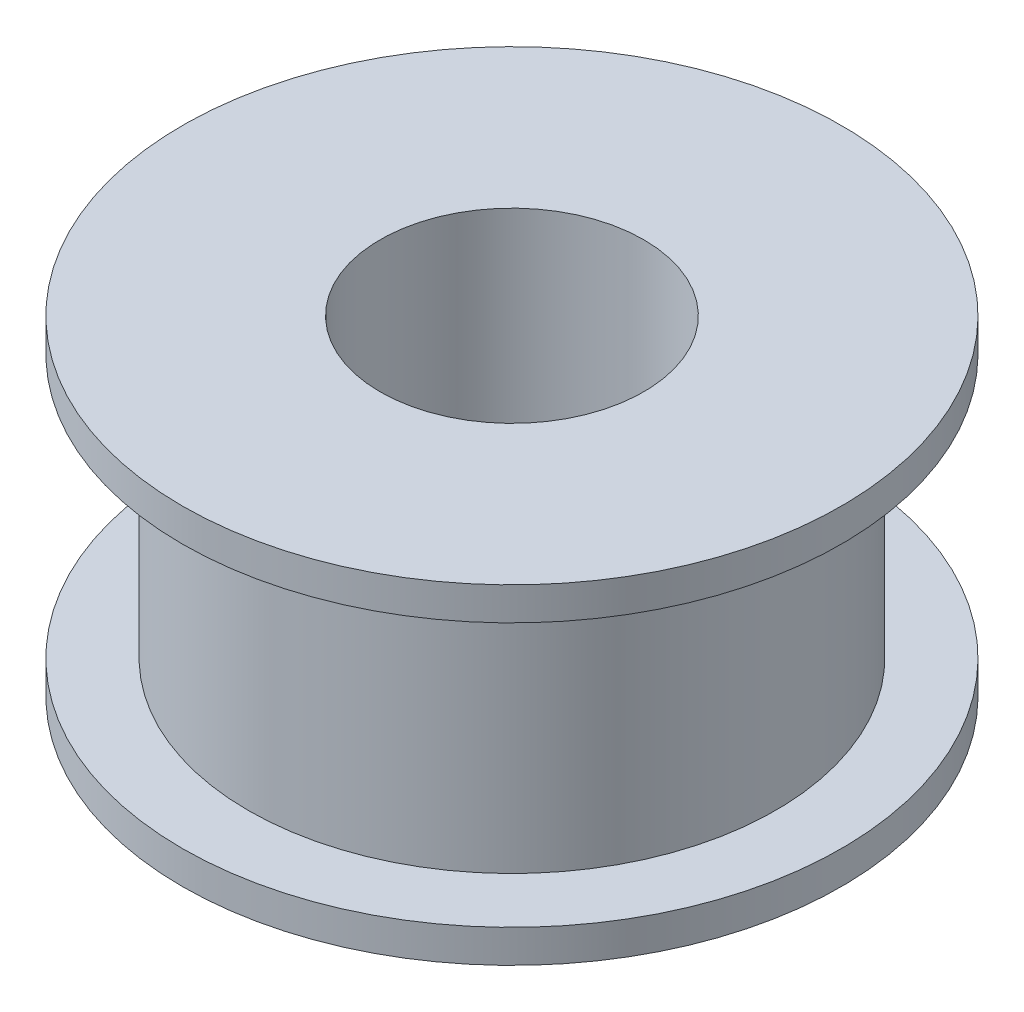
ISO-10303-21;
HEADER;
FILE_DESCRIPTION(('STEP AP214'),'2;1');
FILE_NAME('part.step','',(''),(''),'','','');
FILE_SCHEMA(('AUTOMOTIVE_DESIGN { 1 0 10303 214 1 1 1 1 }'));
ENDSEC;
DATA;
#1=APPLICATION_CONTEXT('core data for automotive mechanical design processes');
#2=APPLICATION_PROTOCOL_DEFINITION('international standard','automotive_design',2000,#1);
#3=PRODUCT_CONTEXT('',#1,'mechanical');
#4=PRODUCT('Part','Part','',(#3));
#5=PRODUCT_RELATED_PRODUCT_CATEGORY('part','',(#4));
#6=PRODUCT_DEFINITION_FORMATION('','',#4);
#7=PRODUCT_DEFINITION_CONTEXT('part definition',#1,'design');
#8=PRODUCT_DEFINITION('design','',#6,#7);
#9=PRODUCT_DEFINITION_SHAPE('','',#8);
#10=(LENGTH_UNIT() NAMED_UNIT(*) SI_UNIT(.MILLI.,.METRE.));
#11=(NAMED_UNIT(*) PLANE_ANGLE_UNIT() SI_UNIT($,.RADIAN.));
#12=(NAMED_UNIT(*) SI_UNIT($,.STERADIAN.) SOLID_ANGLE_UNIT());
#13=UNCERTAINTY_MEASURE_WITH_UNIT(LENGTH_MEASURE(1.E-05),#10,'distance_accuracy_value','');
#14=(GEOMETRIC_REPRESENTATION_CONTEXT(3) GLOBAL_UNCERTAINTY_ASSIGNED_CONTEXT((#13)) GLOBAL_UNIT_ASSIGNED_CONTEXT((#10,
#11,#12)) REPRESENTATION_CONTEXT('',''));
#15=CARTESIAN_POINT('',(0.,0.,0.));
#16=DIRECTION('',(0.,0.,1.));
#17=DIRECTION('',(1.,0.,0.));
#18=AXIS2_PLACEMENT_3D('',#15,#16,#17);
#19=CARTESIAN_POINT('',(0.,25.4,0.));
#20=DIRECTION('',(0.,-1.,0.));
#21=DIRECTION('',(0.,0.,-1.));
#22=AXIS2_PLACEMENT_3D('',#19,#20,#21);
#23=CYLINDRICAL_SURFACE('',#22,25.4);
#24=CARTESIAN_POINT('',(0.,25.4,0.));
#25=DIRECTION('',(0.,1.,0.));
#26=DIRECTION('',(0.,0.,1.));
#27=AXIS2_PLACEMENT_3D('',#24,#25,#26);
#28=CIRCLE('',#27,25.4);
#29=CARTESIAN_POINT('',(0.,25.4,25.4));
#30=VERTEX_POINT('',#29);
#31=EDGE_CURVE('E10',#30,#30,#28,.T.);
#32=ORIENTED_EDGE('',*,*,#31,.F.);
#33=EDGE_LOOP('',(#32));
#34=FACE_BOUND('',#33,.T.);
#35=CARTESIAN_POINT('',(0.,0.,0.));
#36=DIRECTION('',(0.,1.,0.));
#37=DIRECTION('',(0.,0.,1.));
#38=AXIS2_PLACEMENT_3D('',#35,#36,#37);
#39=CIRCLE('',#38,25.4);
#40=CARTESIAN_POINT('',(0.,0.,25.4));
#41=VERTEX_POINT('',#40);
#42=EDGE_CURVE('E42',#41,#41,#39,.T.);
#43=ORIENTED_EDGE('',*,*,#42,.T.);
#44=EDGE_LOOP('',(#43));
#45=FACE_BOUND('',#44,.T.);
#46=ADVANCED_FACE('F39',(#34,#45),#23,.T.);
#47=CARTESIAN_POINT('',(0.,25.4,0.));
#48=DIRECTION('',(0.,-1.,0.));
#49=DIRECTION('',(0.,0.,-1.));
#50=AXIS2_PLACEMENT_3D('',#47,#48,#49);
#51=CYLINDRICAL_SURFACE('',#50,12.7);
#52=CARTESIAN_POINT('',(0.,28.575,0.));
#53=DIRECTION('',(0.,1.,0.));
#54=DIRECTION('',(0.,0.,1.));
#55=AXIS2_PLACEMENT_3D('',#52,#53,#54);
#56=CIRCLE('',#55,12.7);
#57=CARTESIAN_POINT('',(0.,28.575,12.7));
#58=VERTEX_POINT('',#57);
#59=EDGE_CURVE('E57',#58,#58,#56,.T.);
#60=ORIENTED_EDGE('',*,*,#59,.T.);
#61=EDGE_LOOP('',(#60));
#62=FACE_BOUND('',#61,.T.);
#63=CARTESIAN_POINT('',(0.,-3.175,0.));
#64=DIRECTION('',(0.,1.,0.));
#65=DIRECTION('',(0.,0.,1.));
#66=AXIS2_PLACEMENT_3D('',#63,#64,#65);
#67=CIRCLE('',#66,12.7);
#68=CARTESIAN_POINT('',(0.,-3.175,12.7));
#69=VERTEX_POINT('',#68);
#70=EDGE_CURVE('E67',#69,#69,#67,.T.);
#71=ORIENTED_EDGE('',*,*,#70,.F.);
#72=EDGE_LOOP('',(#71));
#73=FACE_BOUND('',#72,.T.);
#74=ADVANCED_FACE('F78',(#62,#73),#51,.F.);
#75=CARTESIAN_POINT('',(0.,28.575,0.));
#76=DIRECTION('',(0.,1.,0.));
#77=DIRECTION('',(0.,0.,1.));
#78=AXIS2_PLACEMENT_3D('',#75,#76,#77);
#79=PLANE('',#78);
#80=CARTESIAN_POINT('',(0.,28.575,0.));
#81=DIRECTION('',(0.,1.,0.));
#82=DIRECTION('',(0.,0.,1.));
#83=AXIS2_PLACEMENT_3D('',#80,#81,#82);
#84=CIRCLE('',#83,31.75);
#85=CARTESIAN_POINT('',(0.,28.575,31.75));
#86=VERTEX_POINT('',#85);
#87=EDGE_CURVE('E47',#86,#86,#84,.T.);
#88=ORIENTED_EDGE('',*,*,#87,.T.);
#89=EDGE_LOOP('',(#88));
#90=FACE_BOUND('',#89,.T.);
#91=ORIENTED_EDGE('',*,*,#59,.F.);
#92=EDGE_LOOP('',(#91));
#93=FACE_BOUND('',#92,.T.);
#94=ADVANCED_FACE('F80',(#90,#93),#79,.T.);
#95=CARTESIAN_POINT('',(0.,25.4,0.));
#96=DIRECTION('',(0.,1.,0.));
#97=DIRECTION('',(0.,0.,1.));
#98=AXIS2_PLACEMENT_3D('',#95,#96,#97);
#99=PLANE('',#98);
#100=ORIENTED_EDGE('',*,*,#31,.T.);
#101=EDGE_LOOP('',(#100));
#102=FACE_BOUND('',#101,.T.);
#103=CARTESIAN_POINT('',(0.,25.4,0.));
#104=DIRECTION('',(0.,1.,0.));
#105=DIRECTION('',(0.,0.,1.));
#106=AXIS2_PLACEMENT_3D('',#103,#104,#105);
#107=CIRCLE('',#106,31.75);
#108=CARTESIAN_POINT('',(0.,25.4,31.75));
#109=VERTEX_POINT('',#108);
#110=EDGE_CURVE('E52',#109,#109,#107,.T.);
#111=ORIENTED_EDGE('',*,*,#110,.F.);
#112=EDGE_LOOP('',(#111));
#113=FACE_BOUND('',#112,.T.);
#114=ADVANCED_FACE('F86',(#102,#113),#99,.F.);
#115=CARTESIAN_POINT('',(0.,28.575,0.));
#116=DIRECTION('',(0.,-1.,0.));
#117=DIRECTION('',(0.,0.,-1.));
#118=AXIS2_PLACEMENT_3D('',#115,#116,#117);
#119=CYLINDRICAL_SURFACE('',#118,31.75);
#120=ORIENTED_EDGE('',*,*,#87,.F.);
#121=EDGE_LOOP('',(#120));
#122=FACE_BOUND('',#121,.T.);
#123=ORIENTED_EDGE('',*,*,#110,.T.);
#124=EDGE_LOOP('',(#123));
#125=FACE_BOUND('',#124,.T.);
#126=ADVANCED_FACE('F91',(#122,#125),#119,.T.);
#127=CARTESIAN_POINT('',(0.,-3.175,0.));
#128=DIRECTION('',(0.,1.,0.));
#129=DIRECTION('',(0.,0.,1.));
#130=AXIS2_PLACEMENT_3D('',#127,#128,#129);
#131=CYLINDRICAL_SURFACE('',#130,31.75);
#132=CARTESIAN_POINT('',(0.,-3.175,0.));
#133=DIRECTION('',(0.,1.,0.));
#134=DIRECTION('',(0.,0.,1.));
#135=AXIS2_PLACEMENT_3D('',#132,#133,#134);
#136=CIRCLE('',#135,31.75);
#137=CARTESIAN_POINT('',(0.,-3.175,31.75));
#138=VERTEX_POINT('',#137);
#139=EDGE_CURVE('E66',#138,#138,#136,.T.);
#140=ORIENTED_EDGE('',*,*,#139,.T.);
#141=EDGE_LOOP('',(#140));
#142=FACE_BOUND('',#141,.T.);
#143=CARTESIAN_POINT('',(0.,0.,0.));
#144=DIRECTION('',(0.,1.,0.));
#145=DIRECTION('',(0.,0.,1.));
#146=AXIS2_PLACEMENT_3D('',#143,#144,#145);
#147=CIRCLE('',#146,31.75);
#148=CARTESIAN_POINT('',(0.,0.,31.75));
#149=VERTEX_POINT('',#148);
#150=EDGE_CURVE('E62',#149,#149,#147,.T.);
#151=ORIENTED_EDGE('',*,*,#150,.F.);
#152=EDGE_LOOP('',(#151));
#153=FACE_BOUND('',#152,.T.);
#154=ADVANCED_FACE('F94',(#142,#153),#131,.T.);
#155=CARTESIAN_POINT('',(0.,-3.175,0.));
#156=DIRECTION('',(0.,-1.,0.));
#157=DIRECTION('',(0.,0.,1.));
#158=AXIS2_PLACEMENT_3D('',#155,#156,#157);
#159=PLANE('',#158);
#160=ORIENTED_EDGE('',*,*,#70,.T.);
#161=EDGE_LOOP('',(#160));
#162=FACE_BOUND('',#161,.T.);
#163=ORIENTED_EDGE('',*,*,#139,.F.);
#164=EDGE_LOOP('',(#163));
#165=FACE_BOUND('',#164,.T.);
#166=ADVANCED_FACE('F75',(#162,#165),#159,.T.);
#167=CARTESIAN_POINT('',(0.,0.,0.));
#168=DIRECTION('',(0.,-1.,0.));
#169=DIRECTION('',(0.,0.,1.));
#170=AXIS2_PLACEMENT_3D('',#167,#168,#169);
#171=PLANE('',#170);
#172=ORIENTED_EDGE('',*,*,#42,.F.);
#173=EDGE_LOOP('',(#172));
#174=FACE_BOUND('',#173,.T.);
#175=ORIENTED_EDGE('',*,*,#150,.T.);
#176=EDGE_LOOP('',(#175));
#177=FACE_BOUND('',#176,.T.);
#178=ADVANCED_FACE('F101',(#174,#177),#171,.F.);
#179=CLOSED_SHELL('',(#46,#74,#94,#114,#126,#154,#166,#178));
#180=MANIFOLD_SOLID_BREP('B2',#179);
#181=ADVANCED_BREP_SHAPE_REPRESENTATION('',(#18,#180),#14);
#182=SHAPE_DEFINITION_REPRESENTATION(#9,#181);
ENDSEC;
END-ISO-10303-21;
